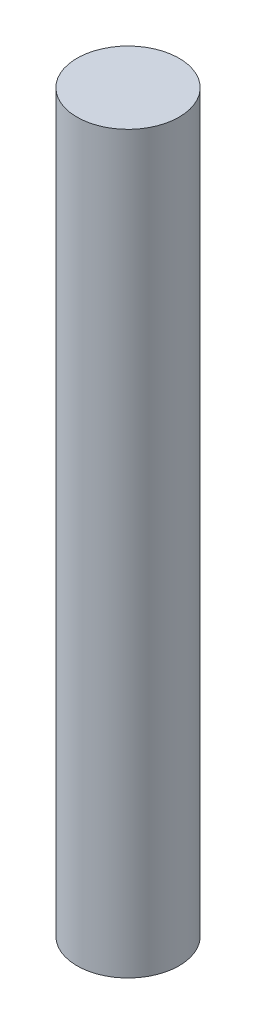
ISO-10303-21;
HEADER;
FILE_DESCRIPTION(('STEP AP214'),'2;1');
FILE_NAME('part.step','',(''),(''),'','','');
FILE_SCHEMA(('AUTOMOTIVE_DESIGN { 1 0 10303 214 1 1 1 1 }'));
ENDSEC;
DATA;
#1=APPLICATION_CONTEXT('core data for automotive mechanical design processes');
#2=APPLICATION_PROTOCOL_DEFINITION('international standard','automotive_design',2000,#1);
#3=PRODUCT_CONTEXT('',#1,'mechanical');
#4=PRODUCT('Part','Part','',(#3));
#5=PRODUCT_RELATED_PRODUCT_CATEGORY('part','',(#4));
#6=PRODUCT_DEFINITION_FORMATION('','',#4);
#7=PRODUCT_DEFINITION_CONTEXT('part definition',#1,'design');
#8=PRODUCT_DEFINITION('design','',#6,#7);
#9=PRODUCT_DEFINITION_SHAPE('','',#8);
#10=(LENGTH_UNIT() NAMED_UNIT(*) SI_UNIT(.MILLI.,.METRE.));
#11=(NAMED_UNIT(*) PLANE_ANGLE_UNIT() SI_UNIT($,.RADIAN.));
#12=(NAMED_UNIT(*) SI_UNIT($,.STERADIAN.) SOLID_ANGLE_UNIT());
#13=UNCERTAINTY_MEASURE_WITH_UNIT(LENGTH_MEASURE(1.E-05),#10,'distance_accuracy_value','');
#14=(GEOMETRIC_REPRESENTATION_CONTEXT(3) GLOBAL_UNCERTAINTY_ASSIGNED_CONTEXT((#13)) GLOBAL_UNIT_ASSIGNED_CONTEXT((#10,
#11,#12)) REPRESENTATION_CONTEXT('',''));
#15=CARTESIAN_POINT('',(0.,0.,0.));
#16=DIRECTION('',(0.,0.,1.));
#17=DIRECTION('',(1.,0.,0.));
#18=AXIS2_PLACEMENT_3D('',#15,#16,#17);
#19=CARTESIAN_POINT('',(0.,21.6,0.));
#20=DIRECTION('',(0.,1.,0.));
#21=DIRECTION('',(-1.,0.,0.));
#22=AXIS2_PLACEMENT_3D('',#19,#20,#21);
#23=PLANE('',#22);
#24=CARTESIAN_POINT('',(0.,21.6,0.));
#25=DIRECTION('',(0.,-1.,0.));
#26=DIRECTION('',(1.,0.,0.));
#27=AXIS2_PLACEMENT_3D('',#24,#25,#26);
#28=CIRCLE('',#27,1.5);
#29=CARTESIAN_POINT('',(1.50000000000001,21.6,0.));
#30=VERTEX_POINT('',#29);
#31=EDGE_CURVE('E10',#30,#30,#28,.T.);
#32=ORIENTED_EDGE('',*,*,#31,.F.);
#33=EDGE_LOOP('',(#32));
#34=FACE_BOUND('',#33,.T.);
#35=ADVANCED_FACE('F30',(#34),#23,.T.);
#36=CARTESIAN_POINT('',(0.,0.,0.));
#37=DIRECTION('',(0.,-1.,0.));
#38=DIRECTION('',(1.,0.,0.));
#39=AXIS2_PLACEMENT_3D('',#36,#37,#38);
#40=CYLINDRICAL_SURFACE('',#39,1.5);
#41=ORIENTED_EDGE('',*,*,#31,.T.);
#42=EDGE_LOOP('',(#41));
#43=FACE_BOUND('',#42,.T.);
#44=CARTESIAN_POINT('',(0.,0.,0.));
#45=DIRECTION('',(0.,-1.,0.));
#46=DIRECTION('',(1.,0.,0.));
#47=AXIS2_PLACEMENT_3D('',#44,#45,#46);
#48=CIRCLE('',#47,1.50000000000001);
#49=CARTESIAN_POINT('',(1.50000000000001,0.,0.));
#50=VERTEX_POINT('',#49);
#51=EDGE_CURVE('E36',#50,#50,#48,.T.);
#52=ORIENTED_EDGE('',*,*,#51,.F.);
#53=EDGE_LOOP('',(#52));
#54=FACE_BOUND('',#53,.T.);
#55=ADVANCED_FACE('F44',(#43,#54),#40,.T.);
#56=CARTESIAN_POINT('',(1.50000000000001,0.,0.));
#57=DIRECTION('',(0.,-1.,0.));
#58=DIRECTION('',(1.,0.,0.));
#59=AXIS2_PLACEMENT_3D('',#56,#57,#58);
#60=PLANE('',#59);
#61=ORIENTED_EDGE('',*,*,#51,.T.);
#62=EDGE_LOOP('',(#61));
#63=FACE_BOUND('',#62,.T.);
#64=ADVANCED_FACE('F42',(#63),#60,.T.);
#65=CLOSED_SHELL('',(#35,#55,#64));
#66=MANIFOLD_SOLID_BREP('B2',#65);
#67=ADVANCED_BREP_SHAPE_REPRESENTATION('',(#18,#66),#14);
#68=SHAPE_DEFINITION_REPRESENTATION(#9,#67);
ENDSEC;
END-ISO-10303-21;
